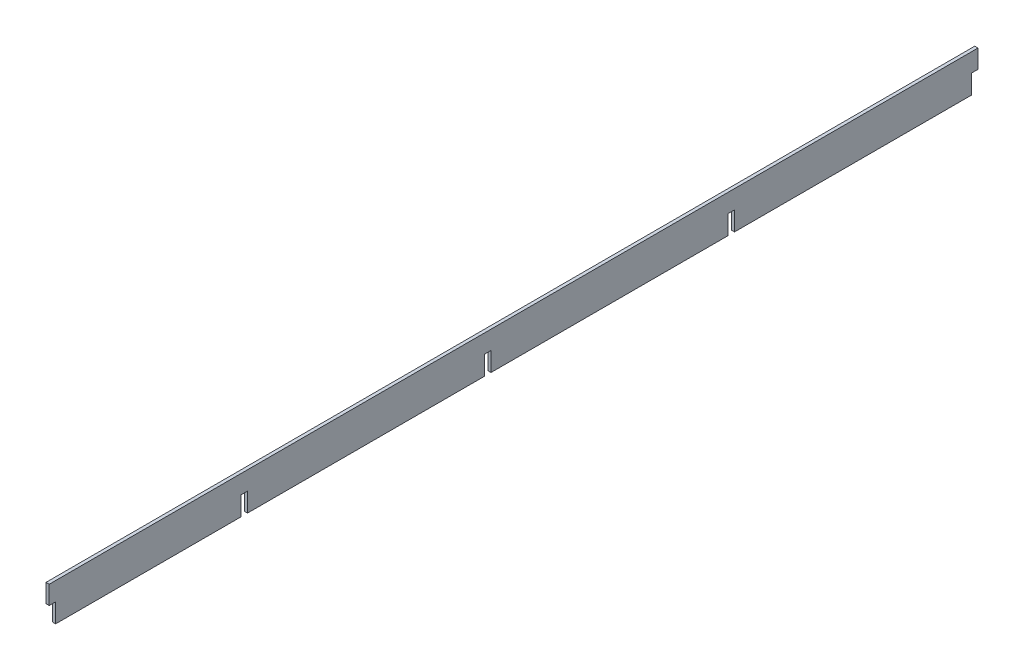
ISO-10303-21;
HEADER;
FILE_DESCRIPTION(('STEP AP214'),'2;1');
FILE_NAME('part.step','',(''),(''),'','','');
FILE_SCHEMA(('AUTOMOTIVE_DESIGN { 1 0 10303 214 1 1 1 1 }'));
ENDSEC;
DATA;
#1=APPLICATION_CONTEXT('core data for automotive mechanical design processes');
#2=APPLICATION_PROTOCOL_DEFINITION('international standard','automotive_design',2000,#1);
#3=PRODUCT_CONTEXT('',#1,'mechanical');
#4=PRODUCT('Part','Part','',(#3));
#5=PRODUCT_RELATED_PRODUCT_CATEGORY('part','',(#4));
#6=PRODUCT_DEFINITION_FORMATION('','',#4);
#7=PRODUCT_DEFINITION_CONTEXT('part definition',#1,'design');
#8=PRODUCT_DEFINITION('design','',#6,#7);
#9=PRODUCT_DEFINITION_SHAPE('','',#8);
#10=(LENGTH_UNIT() NAMED_UNIT(*) SI_UNIT(.MILLI.,.METRE.));
#11=(NAMED_UNIT(*) PLANE_ANGLE_UNIT() SI_UNIT($,.RADIAN.));
#12=(NAMED_UNIT(*) SI_UNIT($,.STERADIAN.) SOLID_ANGLE_UNIT());
#13=UNCERTAINTY_MEASURE_WITH_UNIT(LENGTH_MEASURE(1.E-05),#10,'distance_accuracy_value','');
#14=(GEOMETRIC_REPRESENTATION_CONTEXT(3) GLOBAL_UNCERTAINTY_ASSIGNED_CONTEXT((#13)) GLOBAL_UNIT_ASSIGNED_CONTEXT((#10,
#11,#12)) REPRESENTATION_CONTEXT('',''));
#15=CARTESIAN_POINT('',(0.,0.,0.));
#16=DIRECTION('',(0.,0.,1.));
#17=DIRECTION('',(1.,0.,0.));
#18=AXIS2_PLACEMENT_3D('',#15,#16,#17);
#19=CARTESIAN_POINT('',(788.475040211552,416.670628572467,319.68119407791));
#20=DIRECTION('',(0.,0.,1.));
#21=DIRECTION('',(1.,0.,0.));
#22=AXIS2_PLACEMENT_3D('',#19,#20,#21);
#23=PLANE('',#22);
#24=DIRECTION('',(0.,1.,0.));
#25=VECTOR('',#24,1.);
#26=CARTESIAN_POINT('',(330.901436240696,416.670628572467,319.68119407791));
#27=LINE('',#26,#25);
#28=CARTESIAN_POINT('',(330.901436240696,416.670628572467,319.68119407791));
#29=VERTEX_POINT('',#28);
#30=CARTESIAN_POINT('',(330.901436240696,425.766786018162,319.68119407791));
#31=VERTEX_POINT('',#30);
#32=EDGE_CURVE('E240',#29,#31,#27,.T.);
#33=ORIENTED_EDGE('',*,*,#32,.F.);
#34=DIRECTION('',(-1.,0.,0.));
#35=VECTOR('',#34,1.);
#36=CARTESIAN_POINT('',(788.475040211552,416.670628572467,319.68119407791));
#37=LINE('',#36,#35);
#38=CARTESIAN_POINT('',(329.313936240696,416.670628572467,319.68119407791));
#39=VERTEX_POINT('',#38);
#40=EDGE_CURVE('E37',#29,#39,#37,.T.);
#41=ORIENTED_EDGE('',*,*,#40,.T.);
#42=DIRECTION('',(0.,1.,0.));
#43=VECTOR('',#42,1.);
#44=CARTESIAN_POINT('',(329.313936240696,416.670628572467,319.68119407791));
#45=LINE('',#44,#43);
#46=CARTESIAN_POINT('',(329.313936240696,425.766786018162,319.68119407791));
#47=VERTEX_POINT('',#46);
#48=EDGE_CURVE('E248',#39,#47,#45,.T.);
#49=ORIENTED_EDGE('',*,*,#48,.T.);
#50=DIRECTION('',(-1.,0.,0.));
#51=VECTOR('',#50,1.);
#52=CARTESIAN_POINT('',(788.475040211552,425.766786018162,319.68119407791));
#53=LINE('',#52,#51);
#54=EDGE_CURVE('E136',#31,#47,#53,.T.);
#55=ORIENTED_EDGE('',*,*,#54,.F.);
#56=EDGE_LOOP('',(#33,#41,#49,#55));
#57=FACE_BOUND('',#56,.T.);
#58=ADVANCED_FACE('F33',(#57),#23,.F.);
#59=CARTESIAN_POINT('',(788.475040211552,425.766786018162,773.70619407791));
#60=DIRECTION('',(0.,-1.,0.));
#61=DIRECTION('',(0.,0.,-1.));
#62=AXIS2_PLACEMENT_3D('',#59,#60,#61);
#63=PLANE('',#62);
#64=DIRECTION('',(0.,0.,1.));
#65=VECTOR('',#64,1.);
#66=CARTESIAN_POINT('',(330.901436240696,425.766786018162,773.70619407791));
#67=LINE('',#66,#65);
#68=CARTESIAN_POINT('',(330.901436240696,425.766786018162,776.88119407791));
#69=VERTEX_POINT('',#68);
#70=EDGE_CURVE('E143',#31,#69,#67,.T.);
#71=ORIENTED_EDGE('',*,*,#70,.F.);
#72=ORIENTED_EDGE('',*,*,#54,.T.);
#73=DIRECTION('',(0.,0.,1.));
#74=VECTOR('',#73,1.);
#75=CARTESIAN_POINT('',(329.313936240696,425.766786018162,773.70619407791));
#76=LINE('',#75,#74);
#77=CARTESIAN_POINT('',(329.313936240696,425.766786018162,776.88119407791));
#78=VERTEX_POINT('',#77);
#79=EDGE_CURVE('E247',#47,#78,#76,.T.);
#80=ORIENTED_EDGE('',*,*,#79,.T.);
#81=DIRECTION('',(-1.,0.,0.));
#82=VECTOR('',#81,1.);
#83=CARTESIAN_POINT('',(788.475040211552,425.766786018162,776.88119407791));
#84=LINE('',#83,#82);
#85=EDGE_CURVE('E249',#69,#78,#84,.T.);
#86=ORIENTED_EDGE('',*,*,#85,.F.);
#87=EDGE_LOOP('',(#71,#72,#80,#86));
#88=FACE_BOUND('',#87,.T.);
#89=ADVANCED_FACE('F338',(#88),#63,.F.);
#90=CARTESIAN_POINT('',(788.475040211552,425.766786018162,776.88119407791));
#91=DIRECTION('',(0.,0.,-1.));
#92=DIRECTION('',(-1.,0.,0.));
#93=AXIS2_PLACEMENT_3D('',#90,#91,#92);
#94=PLANE('',#93);
#95=DIRECTION('',(0.,-1.,0.));
#96=VECTOR('',#95,1.);
#97=CARTESIAN_POINT('',(330.901436240696,425.766786018162,776.88119407791));
#98=LINE('',#97,#96);
#99=CARTESIAN_POINT('',(330.901436240696,416.670628572467,776.88119407791));
#100=VERTEX_POINT('',#99);
#101=EDGE_CURVE('E236',#69,#100,#98,.T.);
#102=ORIENTED_EDGE('',*,*,#101,.F.);
#103=ORIENTED_EDGE('',*,*,#85,.T.);
#104=DIRECTION('',(0.,-1.,0.));
#105=VECTOR('',#104,1.);
#106=CARTESIAN_POINT('',(329.313936240696,425.766786018162,776.88119407791));
#107=LINE('',#106,#105);
#108=CARTESIAN_POINT('',(329.313936240696,416.670628572467,776.88119407791));
#109=VERTEX_POINT('',#108);
#110=EDGE_CURVE('E251',#78,#109,#107,.T.);
#111=ORIENTED_EDGE('',*,*,#110,.T.);
#112=DIRECTION('',(-1.,0.,0.));
#113=VECTOR('',#112,1.);
#114=CARTESIAN_POINT('',(788.475040211552,416.670628572467,776.88119407791));
#115=LINE('',#114,#113);
#116=EDGE_CURVE('E252',#100,#109,#115,.T.);
#117=ORIENTED_EDGE('',*,*,#116,.F.);
#118=EDGE_LOOP('',(#102,#103,#111,#117));
#119=FACE_BOUND('',#118,.T.);
#120=ADVANCED_FACE('F341',(#119),#94,.F.);
#121=CARTESIAN_POINT('',(788.475040211552,416.670628572467,776.88119407791));
#122=DIRECTION('',(0.,1.,0.));
#123=DIRECTION('',(0.,0.,1.));
#124=AXIS2_PLACEMENT_3D('',#121,#122,#123);
#125=PLANE('',#124);
#126=DIRECTION('',(0.,0.,-1.));
#127=VECTOR('',#126,1.);
#128=CARTESIAN_POINT('',(330.901436240696,416.670628572467,776.88119407791));
#129=LINE('',#128,#127);
#130=CARTESIAN_POINT('',(330.901436240696,416.670628572467,773.70619407791));
#131=VERTEX_POINT('',#130);
#132=EDGE_CURVE('E233',#100,#131,#129,.T.);
#133=ORIENTED_EDGE('',*,*,#132,.F.);
#134=ORIENTED_EDGE('',*,*,#116,.T.);
#135=DIRECTION('',(0.,0.,-1.));
#136=VECTOR('',#135,1.);
#137=CARTESIAN_POINT('',(329.313936240696,416.670628572467,776.88119407791));
#138=LINE('',#137,#136);
#139=CARTESIAN_POINT('',(329.313936240696,416.670628572467,773.70619407791));
#140=VERTEX_POINT('',#139);
#141=EDGE_CURVE('E254',#109,#140,#138,.T.);
#142=ORIENTED_EDGE('',*,*,#141,.T.);
#143=DIRECTION('',(-1.,0.,0.));
#144=VECTOR('',#143,1.);
#145=CARTESIAN_POINT('',(788.475040211552,416.670628572467,773.70619407791));
#146=LINE('',#145,#144);
#147=EDGE_CURVE('E255',#131,#140,#146,.T.);
#148=ORIENTED_EDGE('',*,*,#147,.F.);
#149=EDGE_LOOP('',(#133,#134,#142,#148));
#150=FACE_BOUND('',#149,.T.);
#151=ADVANCED_FACE('F343',(#150),#125,.F.);
#152=CARTESIAN_POINT('',(788.475040211552,416.670628572467,773.70619407791));
#153=DIRECTION('',(0.,0.,-1.));
#154=DIRECTION('',(-1.,0.,0.));
#155=AXIS2_PLACEMENT_3D('',#152,#153,#154);
#156=PLANE('',#155);
#157=DIRECTION('',(0.,-1.,0.));
#158=VECTOR('',#157,1.);
#159=CARTESIAN_POINT('',(330.901436240696,416.670628572467,773.70619407791));
#160=LINE('',#159,#158);
#161=CARTESIAN_POINT('',(330.901436240696,407.279951489841,773.70619407791));
#162=VERTEX_POINT('',#161);
#163=EDGE_CURVE('E230',#131,#162,#160,.T.);
#164=ORIENTED_EDGE('',*,*,#163,.F.);
#165=ORIENTED_EDGE('',*,*,#147,.T.);
#166=DIRECTION('',(0.,-1.,0.));
#167=VECTOR('',#166,1.);
#168=CARTESIAN_POINT('',(329.313936240696,416.670628572467,773.70619407791));
#169=LINE('',#168,#167);
#170=CARTESIAN_POINT('',(329.313936240696,407.279951489841,773.70619407791));
#171=VERTEX_POINT('',#170);
#172=EDGE_CURVE('E257',#140,#171,#169,.T.);
#173=ORIENTED_EDGE('',*,*,#172,.T.);
#174=DIRECTION('',(-1.,0.,0.));
#175=VECTOR('',#174,1.);
#176=CARTESIAN_POINT('',(788.475040211552,407.279951489841,773.70619407791));
#177=LINE('',#176,#175);
#178=EDGE_CURVE('E258',#162,#171,#177,.T.);
#179=ORIENTED_EDGE('',*,*,#178,.F.);
#180=EDGE_LOOP('',(#164,#165,#173,#179));
#181=FACE_BOUND('',#180,.T.);
#182=ADVANCED_FACE('F347',(#181),#156,.F.);
#183=CARTESIAN_POINT('',(788.475040211552,407.279951489841,773.70619407791));
#184=DIRECTION('',(0.,1.,0.));
#185=DIRECTION('',(0.,0.,1.));
#186=AXIS2_PLACEMENT_3D('',#183,#184,#185);
#187=PLANE('',#186);
#188=DIRECTION('',(0.,0.,-1.));
#189=VECTOR('',#188,1.);
#190=CARTESIAN_POINT('',(330.901436240696,407.279951489841,773.70619407791));
#191=LINE('',#190,#189);
#192=CARTESIAN_POINT('',(330.901436240696,407.279951489841,682.42494407791));
#193=VERTEX_POINT('',#192);
#194=EDGE_CURVE('E227',#162,#193,#191,.T.);
#195=ORIENTED_EDGE('',*,*,#194,.F.);
#196=ORIENTED_EDGE('',*,*,#178,.T.);
#197=DIRECTION('',(0.,0.,-1.));
#198=VECTOR('',#197,1.);
#199=CARTESIAN_POINT('',(329.313936240696,407.279951489841,773.70619407791));
#200=LINE('',#199,#198);
#201=CARTESIAN_POINT('',(329.313936240696,407.279951489841,682.42494407791));
#202=VERTEX_POINT('',#201);
#203=EDGE_CURVE('E260',#171,#202,#200,.T.);
#204=ORIENTED_EDGE('',*,*,#203,.T.);
#205=DIRECTION('',(-1.,0.,0.));
#206=VECTOR('',#205,1.);
#207=CARTESIAN_POINT('',(788.475040211552,407.279951489841,682.42494407791));
#208=LINE('',#207,#206);
#209=EDGE_CURVE('E261',#193,#202,#208,.T.);
#210=ORIENTED_EDGE('',*,*,#209,.F.);
#211=EDGE_LOOP('',(#195,#196,#204,#210));
#212=FACE_BOUND('',#211,.T.);
#213=ADVANCED_FACE('F352',(#212),#187,.F.);
#214=CARTESIAN_POINT('',(788.475040211552,416.670628572467,682.42494407791));
#215=DIRECTION('',(0.,0.,1.));
#216=DIRECTION('',(1.,0.,0.));
#217=AXIS2_PLACEMENT_3D('',#214,#215,#216);
#218=PLANE('',#217);
#219=DIRECTION('',(0.,1.,0.));
#220=VECTOR('',#219,1.);
#221=CARTESIAN_POINT('',(330.901436240696,416.670628572467,682.42494407791));
#222=LINE('',#221,#220);
#223=CARTESIAN_POINT('',(330.901436240696,416.670628572467,682.42494407791));
#224=VERTEX_POINT('',#223);
#225=EDGE_CURVE('E224',#193,#224,#222,.T.);
#226=ORIENTED_EDGE('',*,*,#225,.F.);
#227=ORIENTED_EDGE('',*,*,#209,.T.);
#228=DIRECTION('',(0.,1.,0.));
#229=VECTOR('',#228,1.);
#230=CARTESIAN_POINT('',(329.313936240696,416.670628572467,682.42494407791));
#231=LINE('',#230,#229);
#232=CARTESIAN_POINT('',(329.313936240696,416.670628572467,682.42494407791));
#233=VERTEX_POINT('',#232);
#234=EDGE_CURVE('E263',#202,#233,#231,.T.);
#235=ORIENTED_EDGE('',*,*,#234,.T.);
#236=DIRECTION('',(-1.,0.,0.));
#237=VECTOR('',#236,1.);
#238=CARTESIAN_POINT('',(788.475040211552,416.670628572467,682.42494407791));
#239=LINE('',#238,#237);
#240=EDGE_CURVE('E264',#224,#233,#239,.T.);
#241=ORIENTED_EDGE('',*,*,#240,.F.);
#242=EDGE_LOOP('',(#226,#227,#235,#241));
#243=FACE_BOUND('',#242,.T.);
#244=ADVANCED_FACE('F355',(#243),#218,.F.);
#245=CARTESIAN_POINT('',(788.475040211552,416.670628572467,682.42494407791));
#246=DIRECTION('',(0.,1.,0.));
#247=DIRECTION('',(0.,0.,1.));
#248=AXIS2_PLACEMENT_3D('',#245,#246,#247);
#249=PLANE('',#248);
#250=DIRECTION('',(0.,0.,-1.));
#251=VECTOR('',#250,1.);
#252=CARTESIAN_POINT('',(330.901436240696,416.670628572467,682.42494407791));
#253=LINE('',#252,#251);
#254=CARTESIAN_POINT('',(330.901436240696,416.670628572467,679.24994407791));
#255=VERTEX_POINT('',#254);
#256=EDGE_CURVE('E221',#224,#255,#253,.T.);
#257=ORIENTED_EDGE('',*,*,#256,.F.);
#258=ORIENTED_EDGE('',*,*,#240,.T.);
#259=DIRECTION('',(0.,0.,-1.));
#260=VECTOR('',#259,1.);
#261=CARTESIAN_POINT('',(329.313936240696,416.670628572467,682.42494407791));
#262=LINE('',#261,#260);
#263=CARTESIAN_POINT('',(329.313936240696,416.670628572467,679.24994407791));
#264=VERTEX_POINT('',#263);
#265=EDGE_CURVE('E266',#233,#264,#262,.T.);
#266=ORIENTED_EDGE('',*,*,#265,.T.);
#267=DIRECTION('',(-1.,0.,0.));
#268=VECTOR('',#267,1.);
#269=CARTESIAN_POINT('',(788.475040211552,416.670628572467,679.24994407791));
#270=LINE('',#269,#268);
#271=EDGE_CURVE('E267',#255,#264,#270,.T.);
#272=ORIENTED_EDGE('',*,*,#271,.F.);
#273=EDGE_LOOP('',(#257,#258,#266,#272));
#274=FACE_BOUND('',#273,.T.);
#275=ADVANCED_FACE('F359',(#274),#249,.F.);
#276=CARTESIAN_POINT('',(788.475040211552,416.670628572467,679.24994407791));
#277=DIRECTION('',(0.,0.,-1.));
#278=DIRECTION('',(-1.,0.,0.));
#279=AXIS2_PLACEMENT_3D('',#276,#277,#278);
#280=PLANE('',#279);
#281=DIRECTION('',(0.,-1.,0.));
#282=VECTOR('',#281,1.);
#283=CARTESIAN_POINT('',(330.901436240696,416.670628572467,679.24994407791));
#284=LINE('',#283,#282);
#285=CARTESIAN_POINT('',(330.901436240696,407.279951489841,679.24994407791));
#286=VERTEX_POINT('',#285);
#287=EDGE_CURVE('E218',#255,#286,#284,.T.);
#288=ORIENTED_EDGE('',*,*,#287,.F.);
#289=ORIENTED_EDGE('',*,*,#271,.T.);
#290=DIRECTION('',(0.,-1.,0.));
#291=VECTOR('',#290,1.);
#292=CARTESIAN_POINT('',(329.313936240696,416.670628572467,679.24994407791));
#293=LINE('',#292,#291);
#294=CARTESIAN_POINT('',(329.313936240696,407.279951489841,679.24994407791));
#295=VERTEX_POINT('',#294);
#296=EDGE_CURVE('E269',#264,#295,#293,.T.);
#297=ORIENTED_EDGE('',*,*,#296,.T.);
#298=DIRECTION('',(-1.,0.,0.));
#299=VECTOR('',#298,1.);
#300=CARTESIAN_POINT('',(788.475040211552,407.279951489841,679.24994407791));
#301=LINE('',#300,#299);
#302=EDGE_CURVE('E270',#286,#295,#301,.T.);
#303=ORIENTED_EDGE('',*,*,#302,.F.);
#304=EDGE_LOOP('',(#288,#289,#297,#303));
#305=FACE_BOUND('',#304,.T.);
#306=ADVANCED_FACE('F364',(#305),#280,.F.);
#307=CARTESIAN_POINT('',(788.475040211552,407.279951489841,679.24994407791));
#308=DIRECTION('',(0.,1.,0.));
#309=DIRECTION('',(0.,0.,1.));
#310=AXIS2_PLACEMENT_3D('',#307,#308,#309);
#311=PLANE('',#310);
#312=DIRECTION('',(0.,0.,-1.));
#313=VECTOR('',#312,1.);
#314=CARTESIAN_POINT('',(330.901436240696,407.279951489841,679.24994407791));
#315=LINE('',#314,#313);
#316=CARTESIAN_POINT('',(330.901436240696,407.279951489841,562.56869407791));
#317=VERTEX_POINT('',#316);
#318=EDGE_CURVE('E215',#286,#317,#315,.T.);
#319=ORIENTED_EDGE('',*,*,#318,.F.);
#320=ORIENTED_EDGE('',*,*,#302,.T.);
#321=DIRECTION('',(0.,0.,-1.));
#322=VECTOR('',#321,1.);
#323=CARTESIAN_POINT('',(329.313936240696,407.279951489841,679.24994407791));
#324=LINE('',#323,#322);
#325=CARTESIAN_POINT('',(329.313936240696,407.279951489841,562.56869407791));
#326=VERTEX_POINT('',#325);
#327=EDGE_CURVE('E272',#295,#326,#324,.T.);
#328=ORIENTED_EDGE('',*,*,#327,.T.);
#329=DIRECTION('',(-1.,0.,0.));
#330=VECTOR('',#329,1.);
#331=CARTESIAN_POINT('',(788.475040211552,407.279951489841,562.56869407791));
#332=LINE('',#331,#330);
#333=EDGE_CURVE('E273',#317,#326,#332,.T.);
#334=ORIENTED_EDGE('',*,*,#333,.F.);
#335=EDGE_LOOP('',(#319,#320,#328,#334));
#336=FACE_BOUND('',#335,.T.);
#337=ADVANCED_FACE('F367',(#336),#311,.F.);
#338=CARTESIAN_POINT('',(788.475040211552,416.670628572467,562.56869407791));
#339=DIRECTION('',(0.,0.,1.));
#340=DIRECTION('',(1.,0.,0.));
#341=AXIS2_PLACEMENT_3D('',#338,#339,#340);
#342=PLANE('',#341);
#343=DIRECTION('',(0.,1.,0.));
#344=VECTOR('',#343,1.);
#345=CARTESIAN_POINT('',(330.901436240696,416.670628572467,562.56869407791));
#346=LINE('',#345,#344);
#347=CARTESIAN_POINT('',(330.901436240696,416.670628572467,562.56869407791));
#348=VERTEX_POINT('',#347);
#349=EDGE_CURVE('E212',#317,#348,#346,.T.);
#350=ORIENTED_EDGE('',*,*,#349,.F.);
#351=ORIENTED_EDGE('',*,*,#333,.T.);
#352=DIRECTION('',(0.,1.,0.));
#353=VECTOR('',#352,1.);
#354=CARTESIAN_POINT('',(329.313936240696,416.670628572467,562.56869407791));
#355=LINE('',#354,#353);
#356=CARTESIAN_POINT('',(329.313936240696,416.670628572467,562.56869407791));
#357=VERTEX_POINT('',#356);
#358=EDGE_CURVE('E275',#326,#357,#355,.T.);
#359=ORIENTED_EDGE('',*,*,#358,.T.);
#360=DIRECTION('',(-1.,0.,0.));
#361=VECTOR('',#360,1.);
#362=CARTESIAN_POINT('',(788.475040211552,416.670628572467,562.56869407791));
#363=LINE('',#362,#361);
#364=EDGE_CURVE('E276',#348,#357,#363,.T.);
#365=ORIENTED_EDGE('',*,*,#364,.F.);
#366=EDGE_LOOP('',(#350,#351,#359,#365));
#367=FACE_BOUND('',#366,.T.);
#368=ADVANCED_FACE('F371',(#367),#342,.F.);
#369=CARTESIAN_POINT('',(788.475040211552,416.670628572467,562.56869407791));
#370=DIRECTION('',(0.,1.,0.));
#371=DIRECTION('',(0.,0.,1.));
#372=AXIS2_PLACEMENT_3D('',#369,#370,#371);
#373=PLANE('',#372);
#374=DIRECTION('',(0.,0.,-1.));
#375=VECTOR('',#374,1.);
#376=CARTESIAN_POINT('',(330.901436240696,416.670628572467,562.56869407791));
#377=LINE('',#376,#375);
#378=CARTESIAN_POINT('',(330.901436240696,416.670628572467,559.39369407791));
#379=VERTEX_POINT('',#378);
#380=EDGE_CURVE('E209',#348,#379,#377,.T.);
#381=ORIENTED_EDGE('',*,*,#380,.F.);
#382=ORIENTED_EDGE('',*,*,#364,.T.);
#383=DIRECTION('',(0.,0.,-1.));
#384=VECTOR('',#383,1.);
#385=CARTESIAN_POINT('',(329.313936240696,416.670628572467,562.56869407791));
#386=LINE('',#385,#384);
#387=CARTESIAN_POINT('',(329.313936240696,416.670628572467,559.39369407791));
#388=VERTEX_POINT('',#387);
#389=EDGE_CURVE('E278',#357,#388,#386,.T.);
#390=ORIENTED_EDGE('',*,*,#389,.T.);
#391=DIRECTION('',(-1.,0.,0.));
#392=VECTOR('',#391,1.);
#393=CARTESIAN_POINT('',(788.475040211552,416.670628572467,559.39369407791));
#394=LINE('',#393,#392);
#395=EDGE_CURVE('E279',#379,#388,#394,.T.);
#396=ORIENTED_EDGE('',*,*,#395,.F.);
#397=EDGE_LOOP('',(#381,#382,#390,#396));
#398=FACE_BOUND('',#397,.T.);
#399=ADVANCED_FACE('F376',(#398),#373,.F.);
#400=CARTESIAN_POINT('',(788.475040211552,416.670628572467,559.39369407791));
#401=DIRECTION('',(0.,0.,-1.));
#402=DIRECTION('',(0.,1.,0.));
#403=AXIS2_PLACEMENT_3D('',#400,#401,#402);
#404=PLANE('',#403);
#405=DIRECTION('',(0.,-1.,0.));
#406=VECTOR('',#405,1.);
#407=CARTESIAN_POINT('',(330.901436240696,416.670628572467,559.39369407791));
#408=LINE('',#407,#406);
#409=CARTESIAN_POINT('',(330.901436240696,407.279951489841,559.39369407791));
#410=VERTEX_POINT('',#409);
#411=EDGE_CURVE('E206',#379,#410,#408,.T.);
#412=ORIENTED_EDGE('',*,*,#411,.F.);
#413=ORIENTED_EDGE('',*,*,#395,.T.);
#414=DIRECTION('',(0.,-1.,0.));
#415=VECTOR('',#414,1.);
#416=CARTESIAN_POINT('',(329.313936240696,416.670628572467,559.39369407791));
#417=LINE('',#416,#415);
#418=CARTESIAN_POINT('',(329.313936240696,407.279951489841,559.39369407791));
#419=VERTEX_POINT('',#418);
#420=EDGE_CURVE('E281',#388,#419,#417,.T.);
#421=ORIENTED_EDGE('',*,*,#420,.T.);
#422=DIRECTION('',(-1.,0.,0.));
#423=VECTOR('',#422,1.);
#424=CARTESIAN_POINT('',(788.475040211552,407.279951489841,559.39369407791));
#425=LINE('',#424,#423);
#426=EDGE_CURVE('E282',#410,#419,#425,.T.);
#427=ORIENTED_EDGE('',*,*,#426,.F.);
#428=EDGE_LOOP('',(#412,#413,#421,#427));
#429=FACE_BOUND('',#428,.T.);
#430=ADVANCED_FACE('F379',(#429),#404,.F.);
#431=CARTESIAN_POINT('',(788.475040211552,407.279951489841,559.39369407791));
#432=DIRECTION('',(0.,1.,0.));
#433=DIRECTION('',(0.,0.,1.));
#434=AXIS2_PLACEMENT_3D('',#431,#432,#433);
#435=PLANE('',#434);
#436=DIRECTION('',(0.,0.,-1.));
#437=VECTOR('',#436,1.);
#438=CARTESIAN_POINT('',(330.901436240696,407.279951489841,559.39369407791));
#439=LINE('',#438,#437);
#440=CARTESIAN_POINT('',(330.901436240696,407.279951489841,442.71244407791));
#441=VERTEX_POINT('',#440);
#442=EDGE_CURVE('E203',#410,#441,#439,.T.);
#443=ORIENTED_EDGE('',*,*,#442,.F.);
#444=ORIENTED_EDGE('',*,*,#426,.T.);
#445=DIRECTION('',(0.,0.,-1.));
#446=VECTOR('',#445,1.);
#447=CARTESIAN_POINT('',(329.313936240696,407.279951489841,559.39369407791));
#448=LINE('',#447,#446);
#449=CARTESIAN_POINT('',(329.313936240696,407.279951489841,442.71244407791));
#450=VERTEX_POINT('',#449);
#451=EDGE_CURVE('E284',#419,#450,#448,.T.);
#452=ORIENTED_EDGE('',*,*,#451,.T.);
#453=DIRECTION('',(-1.,0.,0.));
#454=VECTOR('',#453,1.);
#455=CARTESIAN_POINT('',(788.475040211552,407.279951489841,442.71244407791));
#456=LINE('',#455,#454);
#457=EDGE_CURVE('E285',#441,#450,#456,.T.);
#458=ORIENTED_EDGE('',*,*,#457,.F.);
#459=EDGE_LOOP('',(#443,#444,#452,#458));
#460=FACE_BOUND('',#459,.T.);
#461=ADVANCED_FACE('F383',(#460),#435,.F.);
#462=CARTESIAN_POINT('',(788.475040211552,416.670628572467,442.71244407791));
#463=DIRECTION('',(0.,0.,1.));
#464=DIRECTION('',(1.,0.,0.));
#465=AXIS2_PLACEMENT_3D('',#462,#463,#464);
#466=PLANE('',#465);
#467=DIRECTION('',(0.,1.,0.));
#468=VECTOR('',#467,1.);
#469=CARTESIAN_POINT('',(330.901436240696,416.670628572467,442.71244407791));
#470=LINE('',#469,#468);
#471=CARTESIAN_POINT('',(330.901436240696,416.670628572467,442.71244407791));
#472=VERTEX_POINT('',#471);
#473=EDGE_CURVE('E200',#441,#472,#470,.T.);
#474=ORIENTED_EDGE('',*,*,#473,.F.);
#475=ORIENTED_EDGE('',*,*,#457,.T.);
#476=DIRECTION('',(0.,1.,0.));
#477=VECTOR('',#476,1.);
#478=CARTESIAN_POINT('',(329.313936240696,416.670628572467,442.71244407791));
#479=LINE('',#478,#477);
#480=CARTESIAN_POINT('',(329.313936240696,416.670628572467,442.71244407791));
#481=VERTEX_POINT('',#480);
#482=EDGE_CURVE('E287',#450,#481,#479,.T.);
#483=ORIENTED_EDGE('',*,*,#482,.T.);
#484=DIRECTION('',(-1.,0.,0.));
#485=VECTOR('',#484,1.);
#486=CARTESIAN_POINT('',(788.475040211552,416.670628572467,442.71244407791));
#487=LINE('',#486,#485);
#488=EDGE_CURVE('E288',#472,#481,#487,.T.);
#489=ORIENTED_EDGE('',*,*,#488,.F.);
#490=EDGE_LOOP('',(#474,#475,#483,#489));
#491=FACE_BOUND('',#490,.T.);
#492=ADVANCED_FACE('F388',(#491),#466,.F.);
#493=CARTESIAN_POINT('',(788.475040211552,416.670628572467,442.71244407791));
#494=DIRECTION('',(0.,1.,0.));
#495=DIRECTION('',(0.,0.,1.));
#496=AXIS2_PLACEMENT_3D('',#493,#494,#495);
#497=PLANE('',#496);
#498=DIRECTION('',(0.,0.,-1.));
#499=VECTOR('',#498,1.);
#500=CARTESIAN_POINT('',(330.901436240696,416.670628572467,442.71244407791));
#501=LINE('',#500,#499);
#502=CARTESIAN_POINT('',(330.901436240696,416.670628572467,439.53744407791));
#503=VERTEX_POINT('',#502);
#504=EDGE_CURVE('E195',#472,#503,#501,.T.);
#505=ORIENTED_EDGE('',*,*,#504,.F.);
#506=ORIENTED_EDGE('',*,*,#488,.T.);
#507=DIRECTION('',(0.,0.,-1.));
#508=VECTOR('',#507,1.);
#509=CARTESIAN_POINT('',(329.313936240696,416.670628572467,442.71244407791));
#510=LINE('',#509,#508);
#511=CARTESIAN_POINT('',(329.313936240696,416.670628572467,439.53744407791));
#512=VERTEX_POINT('',#511);
#513=EDGE_CURVE('E290',#481,#512,#510,.T.);
#514=ORIENTED_EDGE('',*,*,#513,.T.);
#515=DIRECTION('',(-1.,0.,0.));
#516=VECTOR('',#515,1.);
#517=CARTESIAN_POINT('',(788.475040211552,416.670628572467,439.53744407791));
#518=LINE('',#517,#516);
#519=EDGE_CURVE('E291',#503,#512,#518,.T.);
#520=ORIENTED_EDGE('',*,*,#519,.F.);
#521=EDGE_LOOP('',(#505,#506,#514,#520));
#522=FACE_BOUND('',#521,.T.);
#523=ADVANCED_FACE('F391',(#522),#497,.F.);
#524=CARTESIAN_POINT('',(788.475040211552,416.670628572467,439.53744407791));
#525=DIRECTION('',(0.,0.,-1.));
#526=DIRECTION('',(0.,1.,0.));
#527=AXIS2_PLACEMENT_3D('',#524,#525,#526);
#528=PLANE('',#527);
#529=DIRECTION('',(0.,-1.,0.));
#530=VECTOR('',#529,1.);
#531=CARTESIAN_POINT('',(330.901436240696,416.670628572467,439.53744407791));
#532=LINE('',#531,#530);
#533=CARTESIAN_POINT('',(330.901436240696,407.279951489841,439.53744407791));
#534=VERTEX_POINT('',#533);
#535=EDGE_CURVE('E193',#503,#534,#532,.T.);
#536=ORIENTED_EDGE('',*,*,#535,.F.);
#537=ORIENTED_EDGE('',*,*,#519,.T.);
#538=DIRECTION('',(0.,-1.,0.));
#539=VECTOR('',#538,1.);
#540=CARTESIAN_POINT('',(329.313936240696,416.670628572467,439.53744407791));
#541=LINE('',#540,#539);
#542=CARTESIAN_POINT('',(329.313936240696,407.279951489841,439.53744407791));
#543=VERTEX_POINT('',#542);
#544=EDGE_CURVE('E293',#512,#543,#541,.T.);
#545=ORIENTED_EDGE('',*,*,#544,.T.);
#546=DIRECTION('',(-1.,0.,0.));
#547=VECTOR('',#546,1.);
#548=CARTESIAN_POINT('',(788.475040211552,407.279951489841,439.53744407791));
#549=LINE('',#548,#547);
#550=EDGE_CURVE('E294',#534,#543,#549,.T.);
#551=ORIENTED_EDGE('',*,*,#550,.F.);
#552=EDGE_LOOP('',(#536,#537,#545,#551));
#553=FACE_BOUND('',#552,.T.);
#554=ADVANCED_FACE('F395',(#553),#528,.F.);
#555=CARTESIAN_POINT('',(788.475040211552,407.279951489841,439.53744407791));
#556=DIRECTION('',(0.,1.,0.));
#557=DIRECTION('',(0.,0.,1.));
#558=AXIS2_PLACEMENT_3D('',#555,#556,#557);
#559=PLANE('',#558);
#560=DIRECTION('',(0.,0.,-1.));
#561=VECTOR('',#560,1.);
#562=CARTESIAN_POINT('',(330.901436240696,407.279951489841,439.53744407791));
#563=LINE('',#562,#561);
#564=CARTESIAN_POINT('',(330.901436240696,407.279951489841,322.85619407791));
#565=VERTEX_POINT('',#564);
#566=EDGE_CURVE('E42',#534,#565,#563,.T.);
#567=ORIENTED_EDGE('',*,*,#566,.F.);
#568=ORIENTED_EDGE('',*,*,#550,.T.);
#569=DIRECTION('',(0.,0.,-1.));
#570=VECTOR('',#569,1.);
#571=CARTESIAN_POINT('',(329.313936240696,407.279951489841,439.53744407791));
#572=LINE('',#571,#570);
#573=CARTESIAN_POINT('',(329.313936240696,407.279951489841,322.85619407791));
#574=VERTEX_POINT('',#573);
#575=EDGE_CURVE('E187',#543,#574,#572,.T.);
#576=ORIENTED_EDGE('',*,*,#575,.T.);
#577=DIRECTION('',(-1.,0.,0.));
#578=VECTOR('',#577,1.);
#579=CARTESIAN_POINT('',(788.475040211552,407.279951489841,322.85619407791));
#580=LINE('',#579,#578);
#581=EDGE_CURVE('E178',#565,#574,#580,.T.);
#582=ORIENTED_EDGE('',*,*,#581,.F.);
#583=EDGE_LOOP('',(#567,#568,#576,#582));
#584=FACE_BOUND('',#583,.T.);
#585=ADVANCED_FACE('F184',(#584),#559,.F.);
#586=CARTESIAN_POINT('',(788.475040211552,407.279951489841,322.85619407791));
#587=DIRECTION('',(0.,0.,1.));
#588=DIRECTION('',(1.,0.,0.));
#589=AXIS2_PLACEMENT_3D('',#586,#587,#588);
#590=PLANE('',#589);
#591=DIRECTION('',(0.,1.,0.));
#592=VECTOR('',#591,1.);
#593=CARTESIAN_POINT('',(330.901436240696,407.279951489841,322.85619407791));
#594=LINE('',#593,#592);
#595=CARTESIAN_POINT('',(330.901436240696,416.670628572467,322.85619407791));
#596=VERTEX_POINT('',#595);
#597=EDGE_CURVE('E11',#565,#596,#594,.T.);
#598=ORIENTED_EDGE('',*,*,#597,.F.);
#599=ORIENTED_EDGE('',*,*,#581,.T.);
#600=DIRECTION('',(0.,1.,0.));
#601=VECTOR('',#600,1.);
#602=CARTESIAN_POINT('',(329.313936240696,407.279951489841,322.85619407791));
#603=LINE('',#602,#601);
#604=CARTESIAN_POINT('',(329.313936240696,416.670628572467,322.85619407791));
#605=VERTEX_POINT('',#604);
#606=EDGE_CURVE('E189',#574,#605,#603,.T.);
#607=ORIENTED_EDGE('',*,*,#606,.T.);
#608=DIRECTION('',(-1.,0.,0.));
#609=VECTOR('',#608,1.);
#610=CARTESIAN_POINT('',(788.475040211552,416.670628572467,322.85619407791));
#611=LINE('',#610,#609);
#612=EDGE_CURVE('E55',#596,#605,#611,.T.);
#613=ORIENTED_EDGE('',*,*,#612,.F.);
#614=EDGE_LOOP('',(#598,#599,#607,#613));
#615=FACE_BOUND('',#614,.T.);
#616=ADVANCED_FACE('F177',(#615),#590,.F.);
#617=CARTESIAN_POINT('',(788.475040211552,416.670628572467,322.85619407791));
#618=DIRECTION('',(0.,1.,0.));
#619=DIRECTION('',(0.,0.,1.));
#620=AXIS2_PLACEMENT_3D('',#617,#618,#619);
#621=PLANE('',#620);
#622=DIRECTION('',(0.,0.,-1.));
#623=VECTOR('',#622,1.);
#624=CARTESIAN_POINT('',(330.901436240696,416.670628572467,322.85619407791));
#625=LINE('',#624,#623);
#626=EDGE_CURVE('E243',#596,#29,#625,.T.);
#627=ORIENTED_EDGE('',*,*,#626,.F.);
#628=ORIENTED_EDGE('',*,*,#612,.T.);
#629=DIRECTION('',(0.,0.,-1.));
#630=VECTOR('',#629,1.);
#631=CARTESIAN_POINT('',(329.313936240696,416.670628572467,322.85619407791));
#632=LINE('',#631,#630);
#633=EDGE_CURVE('E245',#605,#39,#632,.T.);
#634=ORIENTED_EDGE('',*,*,#633,.T.);
#635=ORIENTED_EDGE('',*,*,#40,.F.);
#636=EDGE_LOOP('',(#627,#628,#634,#635));
#637=FACE_BOUND('',#636,.T.);
#638=ADVANCED_FACE('F333',(#637),#621,.F.);
#639=CARTESIAN_POINT('',(329.313936240696,0.,0.));
#640=DIRECTION('',(1.,0.,0.));
#641=DIRECTION('',(0.,0.,-1.));
#642=AXIS2_PLACEMENT_3D('',#639,#640,#641);
#643=PLANE('',#642);
#644=ORIENTED_EDGE('',*,*,#48,.F.);
#645=ORIENTED_EDGE('',*,*,#633,.F.);
#646=ORIENTED_EDGE('',*,*,#606,.F.);
#647=ORIENTED_EDGE('',*,*,#575,.F.);
#648=ORIENTED_EDGE('',*,*,#544,.F.);
#649=ORIENTED_EDGE('',*,*,#513,.F.);
#650=ORIENTED_EDGE('',*,*,#482,.F.);
#651=ORIENTED_EDGE('',*,*,#451,.F.);
#652=ORIENTED_EDGE('',*,*,#420,.F.);
#653=ORIENTED_EDGE('',*,*,#389,.F.);
#654=ORIENTED_EDGE('',*,*,#358,.F.);
#655=ORIENTED_EDGE('',*,*,#327,.F.);
#656=ORIENTED_EDGE('',*,*,#296,.F.);
#657=ORIENTED_EDGE('',*,*,#265,.F.);
#658=ORIENTED_EDGE('',*,*,#234,.F.);
#659=ORIENTED_EDGE('',*,*,#203,.F.);
#660=ORIENTED_EDGE('',*,*,#172,.F.);
#661=ORIENTED_EDGE('',*,*,#141,.F.);
#662=ORIENTED_EDGE('',*,*,#110,.F.);
#663=ORIENTED_EDGE('',*,*,#79,.F.);
#664=EDGE_LOOP('',(#644,#645,#646,#647,#648,#649,#650,#651,#652,#653,#654,#655,#656,#657,#658,
#659,#660,#661,#662,#663));
#665=FACE_BOUND('',#664,.T.);
#666=ADVANCED_FACE('F335',(#665),#643,.F.);
#667=CARTESIAN_POINT('',(330.901436240696,442.854809491684,802.28119407791));
#668=DIRECTION('',(1.,0.,0.));
#669=DIRECTION('',(0.,0.,-1.));
#670=AXIS2_PLACEMENT_3D('',#667,#668,#669);
#671=PLANE('',#670);
#672=ORIENTED_EDGE('',*,*,#626,.T.);
#673=ORIENTED_EDGE('',*,*,#32,.T.);
#674=ORIENTED_EDGE('',*,*,#70,.T.);
#675=ORIENTED_EDGE('',*,*,#101,.T.);
#676=ORIENTED_EDGE('',*,*,#132,.T.);
#677=ORIENTED_EDGE('',*,*,#163,.T.);
#678=ORIENTED_EDGE('',*,*,#194,.T.);
#679=ORIENTED_EDGE('',*,*,#225,.T.);
#680=ORIENTED_EDGE('',*,*,#256,.T.);
#681=ORIENTED_EDGE('',*,*,#287,.T.);
#682=ORIENTED_EDGE('',*,*,#318,.T.);
#683=ORIENTED_EDGE('',*,*,#349,.T.);
#684=ORIENTED_EDGE('',*,*,#380,.T.);
#685=ORIENTED_EDGE('',*,*,#411,.T.);
#686=ORIENTED_EDGE('',*,*,#442,.T.);
#687=ORIENTED_EDGE('',*,*,#473,.T.);
#688=ORIENTED_EDGE('',*,*,#504,.T.);
#689=ORIENTED_EDGE('',*,*,#535,.T.);
#690=ORIENTED_EDGE('',*,*,#566,.T.);
#691=ORIENTED_EDGE('',*,*,#597,.T.);
#692=EDGE_LOOP('',(#672,#673,#674,#675,#676,#677,#678,#679,#680,#681,#682,#683,#684,#685,#686,
#687,#688,#689,#690,#691));
#693=FACE_BOUND('',#692,.T.);
#694=ADVANCED_FACE('F35',(#693),#671,.T.);
#695=CLOSED_SHELL('',(#58,#89,#120,#151,#182,#213,#244,#275,#306,#337,#368,#399,#430,#461,#492,
#523,#554,#585,#616,#638,#666,#694));
#696=MANIFOLD_SOLID_BREP('B2',#695);
#697=ADVANCED_BREP_SHAPE_REPRESENTATION('',(#18,#696),#14);
#698=SHAPE_DEFINITION_REPRESENTATION(#9,#697);
ENDSEC;
END-ISO-10303-21;
